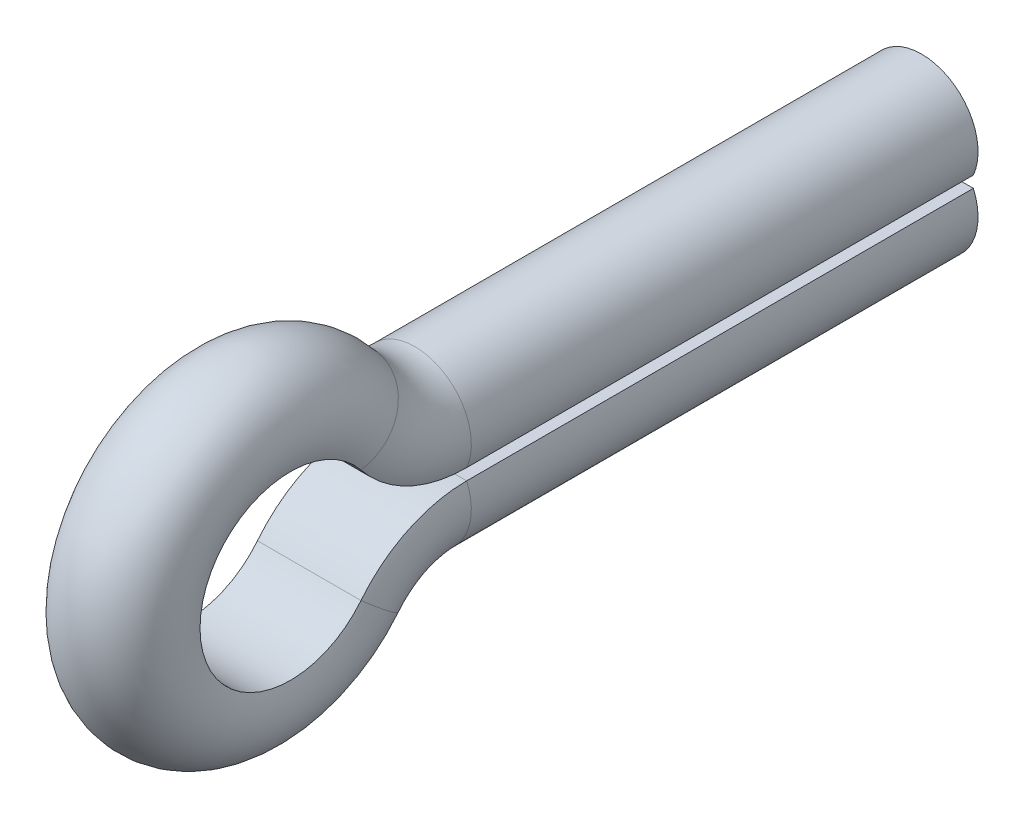
ISO-10303-21;
HEADER;
FILE_DESCRIPTION(('STEP AP214'),'2;1');
FILE_NAME('part.step','',(''),(''),'','','');
FILE_SCHEMA(('AUTOMOTIVE_DESIGN { 1 0 10303 214 1 1 1 1 }'));
ENDSEC;
DATA;
#1=APPLICATION_CONTEXT('core data for automotive mechanical design processes');
#2=APPLICATION_PROTOCOL_DEFINITION('international standard','automotive_design',2000,#1);
#3=PRODUCT_CONTEXT('',#1,'mechanical');
#4=PRODUCT('Part','Part','',(#3));
#5=PRODUCT_RELATED_PRODUCT_CATEGORY('part','',(#4));
#6=PRODUCT_DEFINITION_FORMATION('','',#4);
#7=PRODUCT_DEFINITION_CONTEXT('part definition',#1,'design');
#8=PRODUCT_DEFINITION('design','',#6,#7);
#9=PRODUCT_DEFINITION_SHAPE('','',#8);
#10=(LENGTH_UNIT() NAMED_UNIT(*) SI_UNIT(.MILLI.,.METRE.));
#11=(NAMED_UNIT(*) PLANE_ANGLE_UNIT() SI_UNIT($,.RADIAN.));
#12=(NAMED_UNIT(*) SI_UNIT($,.STERADIAN.) SOLID_ANGLE_UNIT());
#13=UNCERTAINTY_MEASURE_WITH_UNIT(LENGTH_MEASURE(1.E-05),#10,'distance_accuracy_value','');
#14=(GEOMETRIC_REPRESENTATION_CONTEXT(3) GLOBAL_UNCERTAINTY_ASSIGNED_CONTEXT((#13)) GLOBAL_UNIT_ASSIGNED_CONTEXT((#10,
#11,#12)) REPRESENTATION_CONTEXT('',''));
#15=CARTESIAN_POINT('',(0.,0.,0.));
#16=DIRECTION('',(0.,0.,1.));
#17=DIRECTION('',(1.,0.,0.));
#18=AXIS2_PLACEMENT_3D('',#15,#16,#17);
#19=CARTESIAN_POINT('',(0.,1.25,-30.2481507204094));
#20=DIRECTION('',(0.,0.,1.));
#21=DIRECTION('',(1.,0.,0.));
#22=AXIS2_PLACEMENT_3D('',#19,#20,#21);
#23=PLANE('',#22);
#24=CARTESIAN_POINT('',(0.,1.25,-30.2481507204094));
#25=DIRECTION('',(0.,0.,1.));
#26=DIRECTION('',(1.,0.,0.));
#27=AXIS2_PLACEMENT_3D('',#24,#25,#26);
#28=CIRCLE('',#27,2.5);
#29=CARTESIAN_POINT('',(2.29264442613953,0.253114081104898,-30.2481507204094));
#30=VERTEX_POINT('',#29);
#31=CARTESIAN_POINT('',(-2.29264442613953,0.253114081104898,-30.2481507204094));
#32=VERTEX_POINT('',#31);
#33=EDGE_CURVE('E86',#30,#32,#28,.T.);
#34=ORIENTED_EDGE('',*,*,#33,.F.);
#35=DIRECTION('',(1.,0.,0.));
#36=VECTOR('',#35,1.);
#37=CARTESIAN_POINT('',(-2.29264442613953,0.253114081104898,-30.2481507204094));
#38=LINE('',#37,#36);
#39=EDGE_CURVE('E88',#32,#30,#38,.T.);
#40=ORIENTED_EDGE('',*,*,#39,.F.);
#41=EDGE_LOOP('',(#34,#40));
#42=FACE_BOUND('',#41,.T.);
#43=ADVANCED_FACE('F39',(#42),#23,.F.);
#44=CARTESIAN_POINT('',(0.,-1.25,-30.2481507204094));
#45=DIRECTION('',(0.,0.,-1.));
#46=DIRECTION('',(1.,0.,0.));
#47=AXIS2_PLACEMENT_3D('',#44,#45,#46);
#48=PLANE('',#47);
#49=CARTESIAN_POINT('',(0.,-1.25,-30.2481507204094));
#50=DIRECTION('',(0.,0.,-1.));
#51=DIRECTION('',(1.,0.,0.));
#52=AXIS2_PLACEMENT_3D('',#49,#50,#51);
#53=CIRCLE('',#52,2.5);
#54=CARTESIAN_POINT('',(2.29264442613953,-0.253114081104898,-30.2481507204094));
#55=VERTEX_POINT('',#54);
#56=CARTESIAN_POINT('',(-2.29264442613953,-0.253114081104898,-30.2481507204094));
#57=VERTEX_POINT('',#56);
#58=EDGE_CURVE('E52',#55,#57,#53,.T.);
#59=ORIENTED_EDGE('',*,*,#58,.T.);
#60=DIRECTION('',(1.,0.,0.));
#61=VECTOR('',#60,1.);
#62=CARTESIAN_POINT('',(-2.29264442613953,-0.253114081104898,-30.2481507204094));
#63=LINE('',#62,#61);
#64=EDGE_CURVE('E11',#57,#55,#63,.T.);
#65=ORIENTED_EDGE('',*,*,#64,.T.);
#66=EDGE_LOOP('',(#59,#65));
#67=FACE_BOUND('',#66,.T.);
#68=ADVANCED_FACE('F212',(#67),#48,.T.);
#69=CARTESIAN_POINT('',(0.,1.25,-30.2481507204094));
#70=DIRECTION('',(0.,0.,1.));
#71=DIRECTION('',(0.,-1.,0.));
#72=AXIS2_PLACEMENT_3D('',#69,#70,#71);
#73=CYLINDRICAL_SURFACE('',#72,2.5);
#74=DIRECTION('',(0.,0.,1.));
#75=VECTOR('',#74,1.);
#76=CARTESIAN_POINT('',(-2.29264442613953,0.253114081104898,-30.2481507204094));
#77=LINE('',#76,#75);
#78=CARTESIAN_POINT('',(-2.29264442613953,0.253114081104898,-7.806247497998));
#79=VERTEX_POINT('',#78);
#80=EDGE_CURVE('E100',#32,#79,#77,.T.);
#81=ORIENTED_EDGE('',*,*,#80,.T.);
#82=CARTESIAN_POINT('',(0.,1.25,-7.806247497998));
#83=DIRECTION('',(0.,0.,1.));
#84=DIRECTION('',(1.,0.,0.));
#85=AXIS2_PLACEMENT_3D('',#82,#83,#84);
#86=CIRCLE('',#85,2.5);
#87=CARTESIAN_POINT('',(2.29264442613953,0.253114081104898,-7.806247497998));
#88=VERTEX_POINT('',#87);
#89=EDGE_CURVE('E106',#88,#79,#86,.T.);
#90=ORIENTED_EDGE('',*,*,#89,.F.);
#91=DIRECTION('',(0.,0.,1.));
#92=VECTOR('',#91,1.);
#93=CARTESIAN_POINT('',(2.29264442613953,0.253114081104898,-30.2481507204094));
#94=LINE('',#93,#92);
#95=EDGE_CURVE('E99',#30,#88,#94,.T.);
#96=ORIENTED_EDGE('',*,*,#95,.F.);
#97=ORIENTED_EDGE('',*,*,#33,.T.);
#98=EDGE_LOOP('',(#81,#90,#96,#97));
#99=FACE_BOUND('',#98,.T.);
#100=ADVANCED_FACE('F104',(#99),#73,.T.);
#101=CARTESIAN_POINT('',(-2.29264442613953,0.253114081104898,-30.2481507204094));
#102=DIRECTION('',(0.,-1.,0.));
#103=DIRECTION('',(0.,0.,-1.));
#104=AXIS2_PLACEMENT_3D('',#101,#102,#103);
#105=PLANE('',#104);
#106=DIRECTION('',(1.,0.,0.));
#107=VECTOR('',#106,1.);
#108=CARTESIAN_POINT('',(-2.29264442613953,0.253114081104898,-7.806247497998));
#109=LINE('',#108,#107);
#110=EDGE_CURVE('E126',#79,#88,#109,.T.);
#111=ORIENTED_EDGE('',*,*,#110,.F.);
#112=ORIENTED_EDGE('',*,*,#80,.F.);
#113=ORIENTED_EDGE('',*,*,#39,.T.);
#114=ORIENTED_EDGE('',*,*,#95,.T.);
#115=EDGE_LOOP('',(#111,#112,#113,#114));
#116=FACE_BOUND('',#115,.T.);
#117=ADVANCED_FACE('F98',(#116),#105,.T.);
#118=CARTESIAN_POINT('',(0.,6.25,-7.806247497998));
#119=DIRECTION('',(-1.,0.,0.));
#120=DIRECTION('',(0.,0.,1.));
#121=AXIS2_PLACEMENT_3D('',#118,#119,#120);
#122=TOROIDAL_SURFACE('',#121,5.,2.5);
#123=CARTESIAN_POINT('',(-2.29264442613953,6.25,-7.806247497998));
#124=DIRECTION('',(-1.,0.,0.));
#125=DIRECTION('',(0.,-1.,0.));
#126=AXIS2_PLACEMENT_3D('',#123,#124,#125);
#127=CIRCLE('',#126,5.9968859188951);
#128=CARTESIAN_POINT('',(-2.29264442613953,2.50194630069056,-3.12492992798256));
#129=VERTEX_POINT('',#128);
#130=EDGE_CURVE('E117',#79,#129,#127,.T.);
#131=ORIENTED_EDGE('',*,*,#130,.T.);
#132=CARTESIAN_POINT('',(0.,3.125,-3.903123748999));
#133=DIRECTION('',(0.,0.7806247497998,0.625));
#134=DIRECTION('',(1.,0.,0.));
#135=AXIS2_PLACEMENT_3D('',#132,#133,#134);
#136=CIRCLE('',#135,2.5);
#137=CARTESIAN_POINT('',(2.29264442613953,2.50194630069056,-3.12492992798256));
#138=VERTEX_POINT('',#137);
#139=EDGE_CURVE('E113',#138,#129,#136,.T.);
#140=ORIENTED_EDGE('',*,*,#139,.F.);
#141=CARTESIAN_POINT('',(2.29264442613953,6.25,-7.806247497998));
#142=DIRECTION('',(-1.,0.,0.));
#143=DIRECTION('',(0.,-1.,0.));
#144=AXIS2_PLACEMENT_3D('',#141,#142,#143);
#145=CIRCLE('',#144,5.9968859188951);
#146=EDGE_CURVE('E118',#88,#138,#145,.T.);
#147=ORIENTED_EDGE('',*,*,#146,.F.);
#148=ORIENTED_EDGE('',*,*,#89,.T.);
#149=EDGE_LOOP('',(#131,#140,#147,#148));
#150=FACE_BOUND('',#149,.T.);
#151=ADVANCED_FACE('F191',(#150),#122,.T.);
#152=CARTESIAN_POINT('',(0.,6.25,-7.806247497998));
#153=DIRECTION('',(-1.,0.,0.));
#154=DIRECTION('',(0.,0.,1.));
#155=AXIS2_PLACEMENT_3D('',#152,#153,#154);
#156=CYLINDRICAL_SURFACE('',#155,5.9968859188951);
#157=DIRECTION('',(1.,0.,0.));
#158=VECTOR('',#157,1.);
#159=CARTESIAN_POINT('',(-2.29264442613953,2.50194630069056,-3.12492992798256));
#160=LINE('',#159,#158);
#161=EDGE_CURVE('E122',#129,#138,#160,.T.);
#162=ORIENTED_EDGE('',*,*,#161,.F.);
#163=ORIENTED_EDGE('',*,*,#130,.F.);
#164=ORIENTED_EDGE('',*,*,#110,.T.);
#165=ORIENTED_EDGE('',*,*,#146,.T.);
#166=EDGE_LOOP('',(#162,#163,#164,#165));
#167=FACE_BOUND('',#166,.T.);
#168=ADVANCED_FACE('F192',(#167),#156,.T.);
#169=CARTESIAN_POINT('',(0.,0.,0.));
#170=DIRECTION('',(1.,0.,0.));
#171=DIRECTION('',(0.,0.,-1.));
#172=AXIS2_PLACEMENT_3D('',#169,#170,#171);
#173=TOROIDAL_SURFACE('',#172,5.,2.5);
#174=CARTESIAN_POINT('',(-2.29264442613953,0.,0.));
#175=DIRECTION('',(1.,0.,0.));
#176=DIRECTION('',(0.,0.625,-0.7806247497998));
#177=AXIS2_PLACEMENT_3D('',#174,#175,#176);
#178=CIRCLE('',#177,4.0031140811049);
#179=CARTESIAN_POINT('',(-2.29264442613953,-2.50194630069056,-3.12492992798256));
#180=VERTEX_POINT('',#179);
#181=EDGE_CURVE('E131',#129,#180,#178,.T.);
#182=ORIENTED_EDGE('',*,*,#181,.T.);
#183=CARTESIAN_POINT('',(0.,-3.125,-3.903123748999));
#184=DIRECTION('',(0.,0.7806247497998,-0.625));
#185=DIRECTION('',(1.,0.,0.));
#186=AXIS2_PLACEMENT_3D('',#183,#184,#185);
#187=CIRCLE('',#186,2.5);
#188=CARTESIAN_POINT('',(2.29264442613953,-2.50194630069056,-3.12492992798256));
#189=VERTEX_POINT('',#188);
#190=EDGE_CURVE('E127',#189,#180,#187,.T.);
#191=ORIENTED_EDGE('',*,*,#190,.F.);
#192=CARTESIAN_POINT('',(2.29264442613953,0.,0.));
#193=DIRECTION('',(1.,0.,0.));
#194=DIRECTION('',(0.,0.625,-0.7806247497998));
#195=AXIS2_PLACEMENT_3D('',#192,#193,#194);
#196=CIRCLE('',#195,4.0031140811049);
#197=EDGE_CURVE('E132',#138,#189,#196,.T.);
#198=ORIENTED_EDGE('',*,*,#197,.F.);
#199=ORIENTED_EDGE('',*,*,#139,.T.);
#200=EDGE_LOOP('',(#182,#191,#198,#199));
#201=FACE_BOUND('',#200,.T.);
#202=ADVANCED_FACE('F185',(#201),#173,.T.);
#203=CARTESIAN_POINT('',(0.,0.,0.));
#204=DIRECTION('',(1.,0.,0.));
#205=DIRECTION('',(0.,0.,-1.));
#206=AXIS2_PLACEMENT_3D('',#203,#204,#205);
#207=CYLINDRICAL_SURFACE('',#206,4.0031140811049);
#208=DIRECTION('',(1.,0.,0.));
#209=VECTOR('',#208,1.);
#210=CARTESIAN_POINT('',(-2.29264442613953,-2.50194630069056,-3.12492992798256));
#211=LINE('',#210,#209);
#212=EDGE_CURVE('E136',#180,#189,#211,.T.);
#213=ORIENTED_EDGE('',*,*,#212,.F.);
#214=ORIENTED_EDGE('',*,*,#181,.F.);
#215=ORIENTED_EDGE('',*,*,#161,.T.);
#216=ORIENTED_EDGE('',*,*,#197,.T.);
#217=EDGE_LOOP('',(#213,#214,#215,#216));
#218=FACE_BOUND('',#217,.T.);
#219=ADVANCED_FACE('F186',(#218),#207,.F.);
#220=CARTESIAN_POINT('',(0.,-6.25,-7.806247497998));
#221=DIRECTION('',(-1.,0.,0.));
#222=DIRECTION('',(0.,0.,1.));
#223=AXIS2_PLACEMENT_3D('',#220,#221,#222);
#224=TOROIDAL_SURFACE('',#223,5.,2.5);
#225=CARTESIAN_POINT('',(-2.29264442613953,-6.25,-7.806247497998));
#226=DIRECTION('',(-1.,0.,0.));
#227=DIRECTION('',(0.,0.625,0.7806247497998));
#228=AXIS2_PLACEMENT_3D('',#225,#226,#227);
#229=CIRCLE('',#228,5.9968859188951);
#230=CARTESIAN_POINT('',(-2.29264442613953,-0.253114081104899,-7.806247497998));
#231=VERTEX_POINT('',#230);
#232=EDGE_CURVE('E144',#180,#231,#229,.T.);
#233=ORIENTED_EDGE('',*,*,#232,.T.);
#234=CARTESIAN_POINT('',(0.,-1.25,-7.806247497998));
#235=DIRECTION('',(0.,0.,-1.));
#236=DIRECTION('',(1.,0.,0.));
#237=AXIS2_PLACEMENT_3D('',#234,#235,#236);
#238=CIRCLE('',#237,2.5);
#239=CARTESIAN_POINT('',(2.29264442613953,-0.253114081104899,-7.806247497998));
#240=VERTEX_POINT('',#239);
#241=EDGE_CURVE('E140',#240,#231,#238,.T.);
#242=ORIENTED_EDGE('',*,*,#241,.F.);
#243=CARTESIAN_POINT('',(2.29264442613953,-6.25,-7.806247497998));
#244=DIRECTION('',(-1.,0.,0.));
#245=DIRECTION('',(0.,0.625,0.7806247497998));
#246=AXIS2_PLACEMENT_3D('',#243,#244,#245);
#247=CIRCLE('',#246,5.9968859188951);
#248=EDGE_CURVE('E145',#189,#240,#247,.T.);
#249=ORIENTED_EDGE('',*,*,#248,.F.);
#250=ORIENTED_EDGE('',*,*,#190,.T.);
#251=EDGE_LOOP('',(#233,#242,#249,#250));
#252=FACE_BOUND('',#251,.T.);
#253=ADVANCED_FACE('F178',(#252),#224,.T.);
#254=CARTESIAN_POINT('',(0.,-6.25,-7.806247497998));
#255=DIRECTION('',(-1.,0.,0.));
#256=DIRECTION('',(0.,0.,1.));
#257=AXIS2_PLACEMENT_3D('',#254,#255,#256);
#258=CYLINDRICAL_SURFACE('',#257,5.9968859188951);
#259=DIRECTION('',(1.,0.,0.));
#260=VECTOR('',#259,1.);
#261=CARTESIAN_POINT('',(-2.29264442613953,-0.253114081104898,-7.806247497998));
#262=LINE('',#261,#260);
#263=EDGE_CURVE('E149',#231,#240,#262,.T.);
#264=ORIENTED_EDGE('',*,*,#263,.F.);
#265=ORIENTED_EDGE('',*,*,#232,.F.);
#266=ORIENTED_EDGE('',*,*,#212,.T.);
#267=ORIENTED_EDGE('',*,*,#248,.T.);
#268=EDGE_LOOP('',(#264,#265,#266,#267));
#269=FACE_BOUND('',#268,.T.);
#270=ADVANCED_FACE('F180',(#269),#258,.T.);
#271=CARTESIAN_POINT('',(0.,-1.25,-7.806247497998));
#272=DIRECTION('',(0.,0.,-1.));
#273=DIRECTION('',(0.,1.,0.));
#274=AXIS2_PLACEMENT_3D('',#271,#272,#273);
#275=CYLINDRICAL_SURFACE('',#274,2.5);
#276=DIRECTION('',(0.,0.,-1.));
#277=VECTOR('',#276,1.);
#278=CARTESIAN_POINT('',(-2.29264442613953,-0.253114081104898,-7.806247497998));
#279=LINE('',#278,#277);
#280=EDGE_CURVE('E47',#231,#57,#279,.T.);
#281=ORIENTED_EDGE('',*,*,#280,.T.);
#282=ORIENTED_EDGE('',*,*,#58,.F.);
#283=DIRECTION('',(0.,0.,-1.));
#284=VECTOR('',#283,1.);
#285=CARTESIAN_POINT('',(2.29264442613953,-0.253114081104898,-7.806247497998));
#286=LINE('',#285,#284);
#287=EDGE_CURVE('E155',#240,#55,#286,.T.);
#288=ORIENTED_EDGE('',*,*,#287,.F.);
#289=ORIENTED_EDGE('',*,*,#241,.T.);
#290=EDGE_LOOP('',(#281,#282,#288,#289));
#291=FACE_BOUND('',#290,.T.);
#292=ADVANCED_FACE('F205',(#291),#275,.T.);
#293=CARTESIAN_POINT('',(-2.29264442613953,-0.253114081104898,-7.806247497998));
#294=DIRECTION('',(0.,1.,0.));
#295=DIRECTION('',(0.,0.,1.));
#296=AXIS2_PLACEMENT_3D('',#293,#294,#295);
#297=PLANE('',#296);
#298=ORIENTED_EDGE('',*,*,#64,.F.);
#299=ORIENTED_EDGE('',*,*,#280,.F.);
#300=ORIENTED_EDGE('',*,*,#263,.T.);
#301=ORIENTED_EDGE('',*,*,#287,.T.);
#302=EDGE_LOOP('',(#298,#299,#300,#301));
#303=FACE_BOUND('',#302,.T.);
#304=ADVANCED_FACE('F175',(#303),#297,.T.);
#305=CLOSED_SHELL('',(#43,#68,#100,#117,#151,#168,#202,#219,#253,#270,#292,#304));
#306=MANIFOLD_SOLID_BREP('B2',#305);
#307=ADVANCED_BREP_SHAPE_REPRESENTATION('',(#18,#306),#14);
#308=SHAPE_DEFINITION_REPRESENTATION(#9,#307);
ENDSEC;
END-ISO-10303-21;
